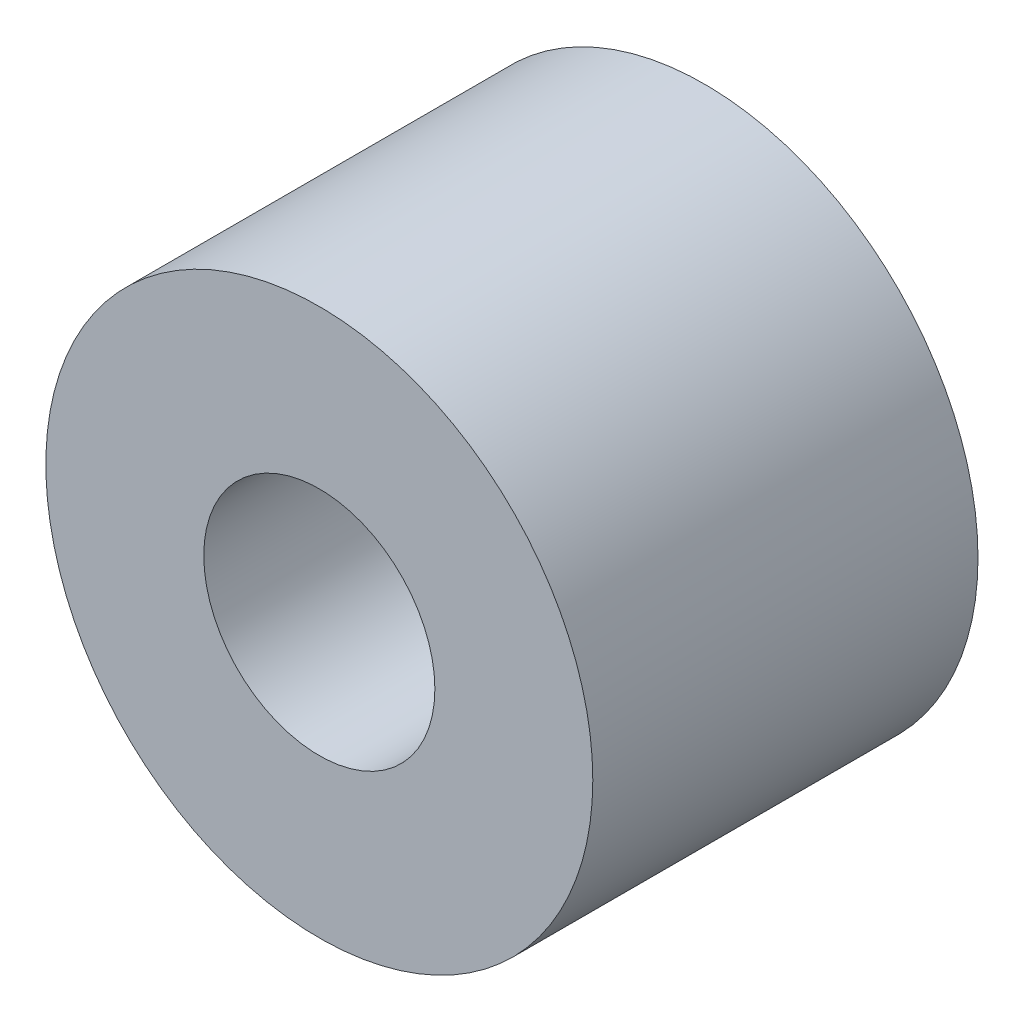
ISO-10303-21;
HEADER;
FILE_DESCRIPTION(('STEP AP214'),'2;1');
FILE_NAME('part.step','',(''),(''),'','','');
FILE_SCHEMA(('AUTOMOTIVE_DESIGN { 1 0 10303 214 1 1 1 1 }'));
ENDSEC;
DATA;
#1=APPLICATION_CONTEXT('core data for automotive mechanical design processes');
#2=APPLICATION_PROTOCOL_DEFINITION('international standard','automotive_design',2000,#1);
#3=PRODUCT_CONTEXT('',#1,'mechanical');
#4=PRODUCT('Part','Part','',(#3));
#5=PRODUCT_RELATED_PRODUCT_CATEGORY('part','',(#4));
#6=PRODUCT_DEFINITION_FORMATION('','',#4);
#7=PRODUCT_DEFINITION_CONTEXT('part definition',#1,'design');
#8=PRODUCT_DEFINITION('design','',#6,#7);
#9=PRODUCT_DEFINITION_SHAPE('','',#8);
#10=(LENGTH_UNIT() NAMED_UNIT(*) SI_UNIT(.MILLI.,.METRE.));
#11=(NAMED_UNIT(*) PLANE_ANGLE_UNIT() SI_UNIT($,.RADIAN.));
#12=(NAMED_UNIT(*) SI_UNIT($,.STERADIAN.) SOLID_ANGLE_UNIT());
#13=UNCERTAINTY_MEASURE_WITH_UNIT(LENGTH_MEASURE(1.E-05),#10,'distance_accuracy_value','');
#14=(GEOMETRIC_REPRESENTATION_CONTEXT(3) GLOBAL_UNCERTAINTY_ASSIGNED_CONTEXT((#13)) GLOBAL_UNIT_ASSIGNED_CONTEXT((#10,
#11,#12)) REPRESENTATION_CONTEXT('',''));
#15=CARTESIAN_POINT('',(0.,0.,0.));
#16=DIRECTION('',(0.,0.,1.));
#17=DIRECTION('',(1.,0.,0.));
#18=AXIS2_PLACEMENT_3D('',#15,#16,#17);
#19=CARTESIAN_POINT('',(0.,0.,20.));
#20=DIRECTION('',(0.,0.,1.));
#21=DIRECTION('',(1.,0.,0.));
#22=AXIS2_PLACEMENT_3D('',#19,#20,#21);
#23=PLANE('',#22);
#24=CARTESIAN_POINT('',(0.,0.,20.));
#25=DIRECTION('',(0.,0.,1.));
#26=DIRECTION('',(1.,0.,0.));
#27=AXIS2_PLACEMENT_3D('',#24,#25,#26);
#28=CIRCLE('',#27,14.2);
#29=CARTESIAN_POINT('',(14.2,0.,20.));
#30=VERTEX_POINT('',#29);
#31=EDGE_CURVE('E10',#30,#30,#28,.T.);
#32=ORIENTED_EDGE('',*,*,#31,.T.);
#33=EDGE_LOOP('',(#32));
#34=FACE_BOUND('',#33,.T.);
#35=CARTESIAN_POINT('',(0.,0.,20.));
#36=DIRECTION('',(0.,0.,1.));
#37=DIRECTION('',(1.,0.,0.));
#38=AXIS2_PLACEMENT_3D('',#35,#36,#37);
#39=CIRCLE('',#38,6.);
#40=CARTESIAN_POINT('',(6.,0.,20.));
#41=VERTEX_POINT('',#40);
#42=EDGE_CURVE('E54',#41,#41,#39,.T.);
#43=ORIENTED_EDGE('',*,*,#42,.F.);
#44=EDGE_LOOP('',(#43));
#45=FACE_BOUND('',#44,.T.);
#46=ADVANCED_FACE('F41',(#34,#45),#23,.T.);
#47=CARTESIAN_POINT('',(0.,0.,0.));
#48=DIRECTION('',(0.,0.,1.));
#49=DIRECTION('',(1.,0.,0.));
#50=AXIS2_PLACEMENT_3D('',#47,#48,#49);
#51=PLANE('',#50);
#52=CARTESIAN_POINT('',(0.,0.,0.));
#53=DIRECTION('',(0.,0.,1.));
#54=DIRECTION('',(1.,0.,0.));
#55=AXIS2_PLACEMENT_3D('',#52,#53,#54);
#56=CIRCLE('',#55,14.2);
#57=CARTESIAN_POINT('',(14.2,0.,0.));
#58=VERTEX_POINT('',#57);
#59=EDGE_CURVE('E44',#58,#58,#56,.T.);
#60=ORIENTED_EDGE('',*,*,#59,.F.);
#61=EDGE_LOOP('',(#60));
#62=FACE_BOUND('',#61,.T.);
#63=CARTESIAN_POINT('',(0.,0.,0.));
#64=DIRECTION('',(0.,0.,1.));
#65=DIRECTION('',(1.,0.,0.));
#66=AXIS2_PLACEMENT_3D('',#63,#64,#65);
#67=CIRCLE('',#66,6.);
#68=CARTESIAN_POINT('',(6.,0.,0.));
#69=VERTEX_POINT('',#68);
#70=EDGE_CURVE('E60',#69,#69,#67,.T.);
#71=ORIENTED_EDGE('',*,*,#70,.T.);
#72=EDGE_LOOP('',(#71));
#73=FACE_BOUND('',#72,.T.);
#74=ADVANCED_FACE('F69',(#62,#73),#51,.F.);
#75=CARTESIAN_POINT('',(0.,0.,20.));
#76=DIRECTION('',(0.,0.,-1.));
#77=DIRECTION('',(-1.,0.,0.));
#78=AXIS2_PLACEMENT_3D('',#75,#76,#77);
#79=CYLINDRICAL_SURFACE('',#78,14.2);
#80=ORIENTED_EDGE('',*,*,#31,.F.);
#81=EDGE_LOOP('',(#80));
#82=FACE_BOUND('',#81,.T.);
#83=ORIENTED_EDGE('',*,*,#59,.T.);
#84=EDGE_LOOP('',(#83));
#85=FACE_BOUND('',#84,.T.);
#86=ADVANCED_FACE('F43',(#82,#85),#79,.T.);
#87=CARTESIAN_POINT('',(0.,0.,20.));
#88=DIRECTION('',(0.,0.,-1.));
#89=DIRECTION('',(-1.,0.,0.));
#90=AXIS2_PLACEMENT_3D('',#87,#88,#89);
#91=CYLINDRICAL_SURFACE('',#90,6.);
#92=ORIENTED_EDGE('',*,*,#42,.T.);
#93=EDGE_LOOP('',(#92));
#94=FACE_BOUND('',#93,.T.);
#95=ORIENTED_EDGE('',*,*,#70,.F.);
#96=EDGE_LOOP('',(#95));
#97=FACE_BOUND('',#96,.T.);
#98=ADVANCED_FACE('F63',(#94,#97),#91,.F.);
#99=CLOSED_SHELL('',(#46,#74,#86,#98));
#100=MANIFOLD_SOLID_BREP('B2',#99);
#101=ADVANCED_BREP_SHAPE_REPRESENTATION('',(#18,#100),#14);
#102=SHAPE_DEFINITION_REPRESENTATION(#9,#101);
ENDSEC;
END-ISO-10303-21;
